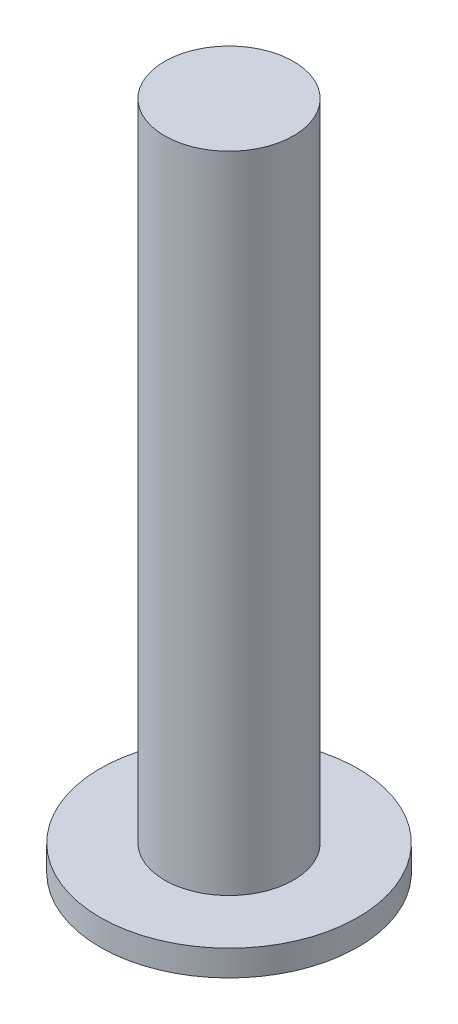
ISO-10303-21;
HEADER;
FILE_DESCRIPTION(('STEP AP214'),'2;1');
FILE_NAME('part.step','',(''),(''),'','','');
FILE_SCHEMA(('AUTOMOTIVE_DESIGN { 1 0 10303 214 1 1 1 1 }'));
ENDSEC;
DATA;
#1=APPLICATION_CONTEXT('core data for automotive mechanical design processes');
#2=APPLICATION_PROTOCOL_DEFINITION('international standard','automotive_design',2000,#1);
#3=PRODUCT_CONTEXT('',#1,'mechanical');
#4=PRODUCT('Part','Part','',(#3));
#5=PRODUCT_RELATED_PRODUCT_CATEGORY('part','',(#4));
#6=PRODUCT_DEFINITION_FORMATION('','',#4);
#7=PRODUCT_DEFINITION_CONTEXT('part definition',#1,'design');
#8=PRODUCT_DEFINITION('design','',#6,#7);
#9=PRODUCT_DEFINITION_SHAPE('','',#8);
#10=(LENGTH_UNIT() NAMED_UNIT(*) SI_UNIT(.MILLI.,.METRE.));
#11=(NAMED_UNIT(*) PLANE_ANGLE_UNIT() SI_UNIT($,.RADIAN.));
#12=(NAMED_UNIT(*) SI_UNIT($,.STERADIAN.) SOLID_ANGLE_UNIT());
#13=UNCERTAINTY_MEASURE_WITH_UNIT(LENGTH_MEASURE(1.E-05),#10,'distance_accuracy_value','');
#14=(GEOMETRIC_REPRESENTATION_CONTEXT(3) GLOBAL_UNCERTAINTY_ASSIGNED_CONTEXT((#13)) GLOBAL_UNIT_ASSIGNED_CONTEXT((#10,
#11,#12)) REPRESENTATION_CONTEXT('',''));
#15=CARTESIAN_POINT('',(0.,0.,0.));
#16=DIRECTION('',(0.,0.,1.));
#17=DIRECTION('',(1.,0.,0.));
#18=AXIS2_PLACEMENT_3D('',#15,#16,#17);
#19=CARTESIAN_POINT('',(0.,20.,0.));
#20=DIRECTION('',(0.,-1.,0.));
#21=DIRECTION('',(0.,0.,-1.));
#22=AXIS2_PLACEMENT_3D('',#19,#20,#21);
#23=CYLINDRICAL_SURFACE('',#22,100.);
#24=CARTESIAN_POINT('',(0.,20.,0.));
#25=DIRECTION('',(0.,1.,0.));
#26=DIRECTION('',(0.,0.,1.));
#27=AXIS2_PLACEMENT_3D('',#24,#25,#26);
#28=CIRCLE('',#27,100.);
#29=CARTESIAN_POINT('',(0.,20.,100.));
#30=VERTEX_POINT('',#29);
#31=EDGE_CURVE('E49',#30,#30,#28,.T.);
#32=ORIENTED_EDGE('',*,*,#31,.F.);
#33=EDGE_LOOP('',(#32));
#34=FACE_BOUND('',#33,.T.);
#35=CARTESIAN_POINT('',(0.,0.,0.));
#36=DIRECTION('',(0.,1.,0.));
#37=DIRECTION('',(0.,0.,1.));
#38=AXIS2_PLACEMENT_3D('',#35,#36,#37);
#39=CIRCLE('',#38,100.);
#40=CARTESIAN_POINT('',(0.,0.,100.));
#41=VERTEX_POINT('',#40);
#42=EDGE_CURVE('E44',#41,#41,#39,.T.);
#43=ORIENTED_EDGE('',*,*,#42,.T.);
#44=EDGE_LOOP('',(#43));
#45=FACE_BOUND('',#44,.T.);
#46=ADVANCED_FACE('F41',(#34,#45),#23,.T.);
#47=CARTESIAN_POINT('',(0.,20.,0.));
#48=DIRECTION('',(0.,1.,0.));
#49=DIRECTION('',(0.,0.,1.));
#50=AXIS2_PLACEMENT_3D('',#47,#48,#49);
#51=PLANE('',#50);
#52=CARTESIAN_POINT('',(0.,20.,0.));
#53=DIRECTION('',(0.,1.,0.));
#54=DIRECTION('',(0.,0.,1.));
#55=AXIS2_PLACEMENT_3D('',#52,#53,#54);
#56=CIRCLE('',#55,50.);
#57=CARTESIAN_POINT('',(0.,20.,50.));
#58=VERTEX_POINT('',#57);
#59=EDGE_CURVE('E10',#58,#58,#56,.T.);
#60=ORIENTED_EDGE('',*,*,#59,.F.);
#61=EDGE_LOOP('',(#60));
#62=FACE_BOUND('',#61,.T.);
#63=ORIENTED_EDGE('',*,*,#31,.T.);
#64=EDGE_LOOP('',(#63));
#65=FACE_BOUND('',#64,.T.);
#66=ADVANCED_FACE('F69',(#62,#65),#51,.T.);
#67=CARTESIAN_POINT('',(0.,0.,0.));
#68=DIRECTION('',(0.,1.,0.));
#69=DIRECTION('',(0.,0.,1.));
#70=AXIS2_PLACEMENT_3D('',#67,#68,#69);
#71=PLANE('',#70);
#72=ORIENTED_EDGE('',*,*,#42,.F.);
#73=EDGE_LOOP('',(#72));
#74=FACE_BOUND('',#73,.T.);
#75=ADVANCED_FACE('F66',(#74),#71,.F.);
#76=CARTESIAN_POINT('',(0.,520.,0.));
#77=DIRECTION('',(0.,-1.,0.));
#78=DIRECTION('',(0.,0.,-1.));
#79=AXIS2_PLACEMENT_3D('',#76,#77,#78);
#80=CYLINDRICAL_SURFACE('',#79,50.);
#81=CARTESIAN_POINT('',(0.,520.,0.));
#82=DIRECTION('',(0.,1.,0.));
#83=DIRECTION('',(0.,0.,1.));
#84=AXIS2_PLACEMENT_3D('',#81,#82,#83);
#85=CIRCLE('',#84,50.);
#86=CARTESIAN_POINT('',(0.,520.,50.));
#87=VERTEX_POINT('',#86);
#88=EDGE_CURVE('E56',#87,#87,#85,.T.);
#89=ORIENTED_EDGE('',*,*,#88,.F.);
#90=EDGE_LOOP('',(#89));
#91=FACE_BOUND('',#90,.T.);
#92=ORIENTED_EDGE('',*,*,#59,.T.);
#93=EDGE_LOOP('',(#92));
#94=FACE_BOUND('',#93,.T.);
#95=ADVANCED_FACE('F68',(#91,#94),#80,.T.);
#96=CARTESIAN_POINT('',(0.,520.,0.));
#97=DIRECTION('',(0.,1.,0.));
#98=DIRECTION('',(0.,0.,1.));
#99=AXIS2_PLACEMENT_3D('',#96,#97,#98);
#100=PLANE('',#99);
#101=ORIENTED_EDGE('',*,*,#88,.T.);
#102=EDGE_LOOP('',(#101));
#103=FACE_BOUND('',#102,.T.);
#104=ADVANCED_FACE('F74',(#103),#100,.T.);
#105=CLOSED_SHELL('',(#46,#66,#75,#95,#104));
#106=MANIFOLD_SOLID_BREP('B2',#105);
#107=ADVANCED_BREP_SHAPE_REPRESENTATION('',(#18,#106),#14);
#108=SHAPE_DEFINITION_REPRESENTATION(#9,#107);
ENDSEC;
END-ISO-10303-21;
